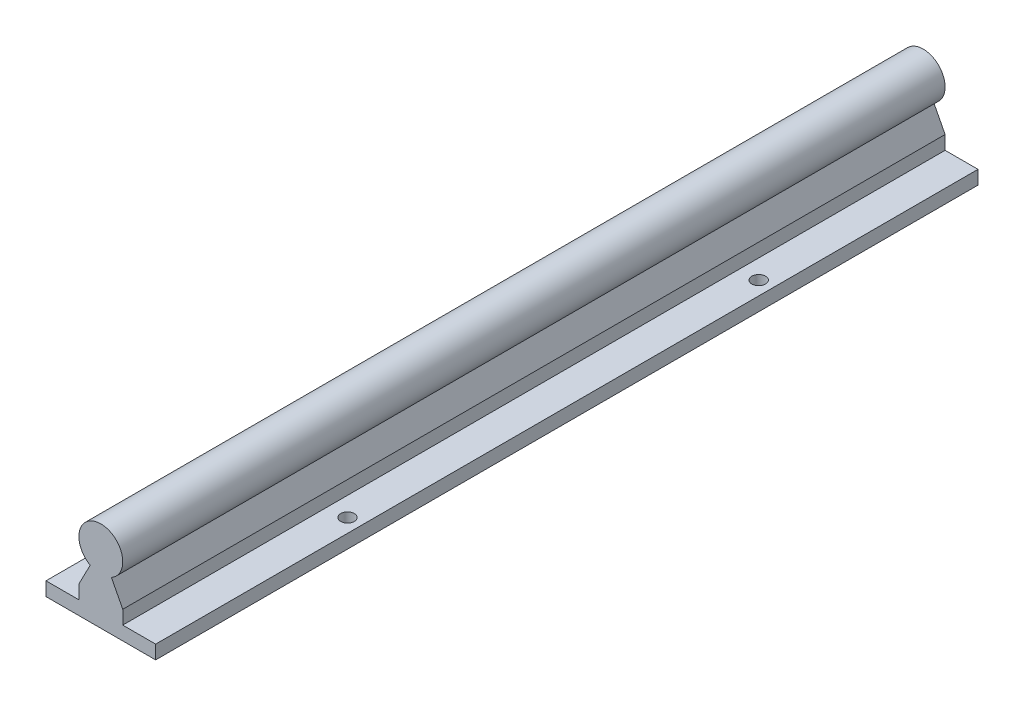
ISO-10303-21;
HEADER;
FILE_DESCRIPTION(('STEP AP214'),'2;1');
FILE_NAME('part.step','',(''),(''),'','','');
FILE_SCHEMA(('AUTOMOTIVE_DESIGN { 1 0 10303 214 1 1 1 1 }'));
ENDSEC;
DATA;
#1=APPLICATION_CONTEXT('core data for automotive mechanical design processes');
#2=APPLICATION_PROTOCOL_DEFINITION('international standard','automotive_design',2000,#1);
#3=PRODUCT_CONTEXT('',#1,'mechanical');
#4=PRODUCT('Part','Part','',(#3));
#5=PRODUCT_RELATED_PRODUCT_CATEGORY('part','',(#4));
#6=PRODUCT_DEFINITION_FORMATION('','',#4);
#7=PRODUCT_DEFINITION_CONTEXT('part definition',#1,'design');
#8=PRODUCT_DEFINITION('design','',#6,#7);
#9=PRODUCT_DEFINITION_SHAPE('','',#8);
#10=(LENGTH_UNIT() NAMED_UNIT(*) SI_UNIT(.MILLI.,.METRE.));
#11=(NAMED_UNIT(*) PLANE_ANGLE_UNIT() SI_UNIT($,.RADIAN.));
#12=(NAMED_UNIT(*) SI_UNIT($,.STERADIAN.) SOLID_ANGLE_UNIT());
#13=UNCERTAINTY_MEASURE_WITH_UNIT(LENGTH_MEASURE(1.E-05),#10,'distance_accuracy_value','');
#14=(GEOMETRIC_REPRESENTATION_CONTEXT(3) GLOBAL_UNCERTAINTY_ASSIGNED_CONTEXT((#13)) GLOBAL_UNIT_ASSIGNED_CONTEXT((#10,
#11,#12)) REPRESENTATION_CONTEXT('',''));
#15=CARTESIAN_POINT('',(0.,0.,0.));
#16=DIRECTION('',(0.,0.,1.));
#17=DIRECTION('',(1.,0.,0.));
#18=AXIS2_PLACEMENT_3D('',#15,#16,#17);
#19=CARTESIAN_POINT('',(-10.3929134539516,5.36146586323541,300.));
#20=DIRECTION('',(-0.88871189671419,0.458466099770382,0.));
#21=DIRECTION('',(-0.458466099770382,-0.888711896714191,0.));
#22=AXIS2_PLACEMENT_3D('',#19,#20,#21);
#23=PLANE('',#22);
#24=DIRECTION('',(0.458466099770382,0.888711896714191,0.));
#25=VECTOR('',#24,1.);
#26=CARTESIAN_POINT('',(-10.3929134539516,5.36146586323541,0.));
#27=LINE('',#26,#25);
#28=CARTESIAN_POINT('',(-8.,10.,0.));
#29=VERTEX_POINT('',#28);
#30=CARTESIAN_POINT('',(-3.87298334620742,18.,0.));
#31=VERTEX_POINT('',#30);
#32=EDGE_CURVE('E144',#29,#31,#27,.T.);
#33=ORIENTED_EDGE('',*,*,#32,.F.);
#34=DIRECTION('',(0.,0.,-1.));
#35=VECTOR('',#34,1.);
#36=CARTESIAN_POINT('',(-8.,10.,300.));
#37=LINE('',#36,#35);
#38=CARTESIAN_POINT('',(-8.,10.,300.));
#39=VERTEX_POINT('',#38);
#40=EDGE_CURVE('E41',#39,#29,#37,.T.);
#41=ORIENTED_EDGE('',*,*,#40,.F.);
#42=DIRECTION('',(0.458466099770382,0.888711896714191,0.));
#43=VECTOR('',#42,1.);
#44=CARTESIAN_POINT('',(-10.3929134539516,5.36146586323541,300.));
#45=LINE('',#44,#43);
#46=CARTESIAN_POINT('',(-3.87298334620742,18.,300.));
#47=VERTEX_POINT('',#46);
#48=EDGE_CURVE('E165',#39,#47,#45,.T.);
#49=ORIENTED_EDGE('',*,*,#48,.T.);
#50=DIRECTION('',(0.,0.,-1.));
#51=VECTOR('',#50,1.);
#52=CARTESIAN_POINT('',(-3.87298334620742,18.,300.));
#53=LINE('',#52,#51);
#54=EDGE_CURVE('E11',#47,#31,#53,.T.);
#55=ORIENTED_EDGE('',*,*,#54,.T.);
#56=EDGE_LOOP('',(#33,#41,#49,#55));
#57=FACE_BOUND('',#56,.T.);
#58=ADVANCED_FACE('F33',(#57),#23,.T.);
#59=CARTESIAN_POINT('',(-8.,0.,300.));
#60=DIRECTION('',(-1.,0.,0.));
#61=DIRECTION('',(0.,0.,1.));
#62=AXIS2_PLACEMENT_3D('',#59,#60,#61);
#63=PLANE('',#62);
#64=DIRECTION('',(0.,1.,0.));
#65=VECTOR('',#64,1.);
#66=CARTESIAN_POINT('',(-8.,0.,0.));
#67=LINE('',#66,#65);
#68=CARTESIAN_POINT('',(-8.,5.,0.));
#69=VERTEX_POINT('',#68);
#70=EDGE_CURVE('E146',#69,#29,#67,.T.);
#71=ORIENTED_EDGE('',*,*,#70,.F.);
#72=DIRECTION('',(0.,0.,-1.));
#73=VECTOR('',#72,1.);
#74=CARTESIAN_POINT('',(-8.,5.,300.));
#75=LINE('',#74,#73);
#76=CARTESIAN_POINT('',(-8.,5.,300.));
#77=VERTEX_POINT('',#76);
#78=EDGE_CURVE('E175',#77,#69,#75,.T.);
#79=ORIENTED_EDGE('',*,*,#78,.F.);
#80=DIRECTION('',(0.,1.,0.));
#81=VECTOR('',#80,1.);
#82=CARTESIAN_POINT('',(-8.,0.,300.));
#83=LINE('',#82,#81);
#84=EDGE_CURVE('E181',#77,#39,#83,.T.);
#85=ORIENTED_EDGE('',*,*,#84,.T.);
#86=ORIENTED_EDGE('',*,*,#40,.T.);
#87=EDGE_LOOP('',(#71,#79,#85,#86));
#88=FACE_BOUND('',#87,.T.);
#89=ADVANCED_FACE('F179',(#88),#63,.T.);
#90=CARTESIAN_POINT('',(0.,5.,300.));
#91=DIRECTION('',(0.,1.,0.));
#92=DIRECTION('',(0.,0.,1.));
#93=AXIS2_PLACEMENT_3D('',#90,#91,#92);
#94=PLANE('',#93);
#95=CARTESIAN_POINT('',(-15.,5.,75.));
#96=DIRECTION('',(0.,1.,0.));
#97=DIRECTION('',(0.,0.,1.));
#98=AXIS2_PLACEMENT_3D('',#95,#96,#97);
#99=CIRCLE('',#98,2.49999999999999);
#100=CARTESIAN_POINT('',(-15.,5.,77.5));
#101=VERTEX_POINT('',#100);
#102=EDGE_CURVE('E238',#101,#101,#99,.T.);
#103=ORIENTED_EDGE('',*,*,#102,.F.);
#104=EDGE_LOOP('',(#103));
#105=FACE_BOUND('',#104,.T.);
#106=CARTESIAN_POINT('',(-15.,5.,225.));
#107=DIRECTION('',(0.,1.,0.));
#108=DIRECTION('',(0.,0.,1.));
#109=AXIS2_PLACEMENT_3D('',#106,#107,#108);
#110=CIRCLE('',#109,2.49999999999999);
#111=CARTESIAN_POINT('',(-15.,5.,227.5));
#112=VERTEX_POINT('',#111);
#113=EDGE_CURVE('E226',#112,#112,#110,.T.);
#114=ORIENTED_EDGE('',*,*,#113,.F.);
#115=EDGE_LOOP('',(#114));
#116=FACE_BOUND('',#115,.T.);
#117=DIRECTION('',(1.,0.,0.));
#118=VECTOR('',#117,1.);
#119=CARTESIAN_POINT('',(0.,5.,0.));
#120=LINE('',#119,#118);
#121=CARTESIAN_POINT('',(-20.,5.,0.));
#122=VERTEX_POINT('',#121);
#123=EDGE_CURVE('E150',#122,#69,#120,.T.);
#124=ORIENTED_EDGE('',*,*,#123,.F.);
#125=DIRECTION('',(0.,0.,-1.));
#126=VECTOR('',#125,1.);
#127=CARTESIAN_POINT('',(-20.,5.,300.));
#128=LINE('',#127,#126);
#129=CARTESIAN_POINT('',(-20.,5.,300.));
#130=VERTEX_POINT('',#129);
#131=EDGE_CURVE('E173',#130,#122,#128,.T.);
#132=ORIENTED_EDGE('',*,*,#131,.F.);
#133=DIRECTION('',(1.,0.,0.));
#134=VECTOR('',#133,1.);
#135=CARTESIAN_POINT('',(0.,5.,300.));
#136=LINE('',#135,#134);
#137=EDGE_CURVE('E191',#130,#77,#136,.T.);
#138=ORIENTED_EDGE('',*,*,#137,.T.);
#139=ORIENTED_EDGE('',*,*,#78,.T.);
#140=EDGE_LOOP('',(#124,#132,#138,#139));
#141=FACE_BOUND('',#140,.T.);
#142=ADVANCED_FACE('F188',(#105,#116,#141),#94,.T.);
#143=CARTESIAN_POINT('',(-20.,0.,300.));
#144=DIRECTION('',(-1.,0.,0.));
#145=DIRECTION('',(0.,0.,1.));
#146=AXIS2_PLACEMENT_3D('',#143,#144,#145);
#147=PLANE('',#146);
#148=DIRECTION('',(0.,1.,0.));
#149=VECTOR('',#148,1.);
#150=CARTESIAN_POINT('',(-20.,0.,0.));
#151=LINE('',#150,#149);
#152=CARTESIAN_POINT('',(-20.,0.,0.));
#153=VERTEX_POINT('',#152);
#154=EDGE_CURVE('E153',#153,#122,#151,.T.);
#155=ORIENTED_EDGE('',*,*,#154,.F.);
#156=DIRECTION('',(0.,0.,-1.));
#157=VECTOR('',#156,1.);
#158=CARTESIAN_POINT('',(-20.,0.,300.));
#159=LINE('',#158,#157);
#160=CARTESIAN_POINT('',(-20.,0.,300.));
#161=VERTEX_POINT('',#160);
#162=EDGE_CURVE('E171',#161,#153,#159,.T.);
#163=ORIENTED_EDGE('',*,*,#162,.F.);
#164=DIRECTION('',(0.,1.,0.));
#165=VECTOR('',#164,1.);
#166=CARTESIAN_POINT('',(-20.,0.,300.));
#167=LINE('',#166,#165);
#168=EDGE_CURVE('E195',#161,#130,#167,.T.);
#169=ORIENTED_EDGE('',*,*,#168,.T.);
#170=ORIENTED_EDGE('',*,*,#131,.T.);
#171=EDGE_LOOP('',(#155,#163,#169,#170));
#172=FACE_BOUND('',#171,.T.);
#173=ADVANCED_FACE('F201',(#172),#147,.T.);
#174=CARTESIAN_POINT('',(0.,0.,300.));
#175=DIRECTION('',(0.,1.,0.));
#176=DIRECTION('',(0.,0.,1.));
#177=AXIS2_PLACEMENT_3D('',#174,#175,#176);
#178=PLANE('',#177);
#179=CARTESIAN_POINT('',(-15.,0.,75.));
#180=DIRECTION('',(0.,1.,0.));
#181=DIRECTION('',(0.,0.,1.));
#182=AXIS2_PLACEMENT_3D('',#179,#180,#181);
#183=CIRCLE('',#182,2.49999999999999);
#184=CARTESIAN_POINT('',(-15.,0.,77.5));
#185=VERTEX_POINT('',#184);
#186=EDGE_CURVE('E235',#185,#185,#183,.T.);
#187=ORIENTED_EDGE('',*,*,#186,.T.);
#188=EDGE_LOOP('',(#187));
#189=FACE_BOUND('',#188,.T.);
#190=CARTESIAN_POINT('',(15.,0.,75.));
#191=DIRECTION('',(0.,1.,0.));
#192=DIRECTION('',(0.,0.,1.));
#193=AXIS2_PLACEMENT_3D('',#190,#191,#192);
#194=CIRCLE('',#193,2.49999999999999);
#195=CARTESIAN_POINT('',(15.,0.,77.5));
#196=VERTEX_POINT('',#195);
#197=EDGE_CURVE('E229',#196,#196,#194,.T.);
#198=ORIENTED_EDGE('',*,*,#197,.T.);
#199=EDGE_LOOP('',(#198));
#200=FACE_BOUND('',#199,.T.);
#201=CARTESIAN_POINT('',(-15.,0.,225.));
#202=DIRECTION('',(0.,1.,0.));
#203=DIRECTION('',(0.,0.,1.));
#204=AXIS2_PLACEMENT_3D('',#201,#202,#203);
#205=CIRCLE('',#204,2.49999999999999);
#206=CARTESIAN_POINT('',(-15.,0.,227.5));
#207=VERTEX_POINT('',#206);
#208=EDGE_CURVE('E223',#207,#207,#205,.T.);
#209=ORIENTED_EDGE('',*,*,#208,.T.);
#210=EDGE_LOOP('',(#209));
#211=FACE_BOUND('',#210,.T.);
#212=CARTESIAN_POINT('',(15.,0.,225.));
#213=DIRECTION('',(0.,1.,0.));
#214=DIRECTION('',(0.,0.,1.));
#215=AXIS2_PLACEMENT_3D('',#212,#213,#214);
#216=CIRCLE('',#215,2.49999999999999);
#217=CARTESIAN_POINT('',(15.,0.,227.5));
#218=VERTEX_POINT('',#217);
#219=EDGE_CURVE('E215',#218,#218,#216,.T.);
#220=ORIENTED_EDGE('',*,*,#219,.T.);
#221=EDGE_LOOP('',(#220));
#222=FACE_BOUND('',#221,.T.);
#223=DIRECTION('',(1.,0.,0.));
#224=VECTOR('',#223,1.);
#225=CARTESIAN_POINT('',(0.,0.,0.));
#226=LINE('',#225,#224);
#227=CARTESIAN_POINT('',(20.,0.,0.));
#228=VERTEX_POINT('',#227);
#229=EDGE_CURVE('E156',#153,#228,#226,.T.);
#230=ORIENTED_EDGE('',*,*,#229,.T.);
#231=DIRECTION('',(0.,0.,-1.));
#232=VECTOR('',#231,1.);
#233=CARTESIAN_POINT('',(20.,0.,300.));
#234=LINE('',#233,#232);
#235=CARTESIAN_POINT('',(20.,0.,300.));
#236=VERTEX_POINT('',#235);
#237=EDGE_CURVE('E133',#236,#228,#234,.T.);
#238=ORIENTED_EDGE('',*,*,#237,.F.);
#239=DIRECTION('',(1.,0.,0.));
#240=VECTOR('',#239,1.);
#241=CARTESIAN_POINT('',(0.,0.,300.));
#242=LINE('',#241,#240);
#243=EDGE_CURVE('E121',#161,#236,#242,.T.);
#244=ORIENTED_EDGE('',*,*,#243,.F.);
#245=ORIENTED_EDGE('',*,*,#162,.T.);
#246=EDGE_LOOP('',(#230,#238,#244,#245));
#247=FACE_BOUND('',#246,.T.);
#248=ADVANCED_FACE('F203',(#189,#200,#211,#222,#247),#178,.F.);
#249=CARTESIAN_POINT('',(20.,0.,300.));
#250=DIRECTION('',(-1.,0.,0.));
#251=DIRECTION('',(0.,0.,1.));
#252=AXIS2_PLACEMENT_3D('',#249,#250,#251);
#253=PLANE('',#252);
#254=DIRECTION('',(0.,1.,0.));
#255=VECTOR('',#254,1.);
#256=CARTESIAN_POINT('',(20.,0.,0.));
#257=LINE('',#256,#255);
#258=CARTESIAN_POINT('',(20.,5.,0.));
#259=VERTEX_POINT('',#258);
#260=EDGE_CURVE('E130',#228,#259,#257,.T.);
#261=ORIENTED_EDGE('',*,*,#260,.T.);
#262=DIRECTION('',(0.,0.,-1.));
#263=VECTOR('',#262,1.);
#264=CARTESIAN_POINT('',(20.,5.,300.));
#265=LINE('',#264,#263);
#266=CARTESIAN_POINT('',(20.,5.,300.));
#267=VERTEX_POINT('',#266);
#268=EDGE_CURVE('E127',#267,#259,#265,.T.);
#269=ORIENTED_EDGE('',*,*,#268,.F.);
#270=DIRECTION('',(0.,1.,0.));
#271=VECTOR('',#270,1.);
#272=CARTESIAN_POINT('',(20.,0.,300.));
#273=LINE('',#272,#271);
#274=EDGE_CURVE('E113',#236,#267,#273,.T.);
#275=ORIENTED_EDGE('',*,*,#274,.F.);
#276=ORIENTED_EDGE('',*,*,#237,.T.);
#277=EDGE_LOOP('',(#261,#269,#275,#276));
#278=FACE_BOUND('',#277,.T.);
#279=ADVANCED_FACE('F128',(#278),#253,.F.);
#280=CARTESIAN_POINT('',(0.,5.,300.));
#281=DIRECTION('',(0.,-1.,0.));
#282=DIRECTION('',(0.,0.,-1.));
#283=AXIS2_PLACEMENT_3D('',#280,#281,#282);
#284=PLANE('',#283);
#285=CARTESIAN_POINT('',(15.,5.,75.));
#286=DIRECTION('',(0.,1.,0.));
#287=DIRECTION('',(0.,0.,1.));
#288=AXIS2_PLACEMENT_3D('',#285,#286,#287);
#289=CIRCLE('',#288,2.49999999999999);
#290=CARTESIAN_POINT('',(15.,5.,77.5));
#291=VERTEX_POINT('',#290);
#292=EDGE_CURVE('E232',#291,#291,#289,.T.);
#293=ORIENTED_EDGE('',*,*,#292,.F.);
#294=EDGE_LOOP('',(#293));
#295=FACE_BOUND('',#294,.T.);
#296=CARTESIAN_POINT('',(15.,5.,225.));
#297=DIRECTION('',(0.,1.,0.));
#298=DIRECTION('',(0.,0.,1.));
#299=AXIS2_PLACEMENT_3D('',#296,#297,#298);
#300=CIRCLE('',#299,2.49999999999999);
#301=CARTESIAN_POINT('',(15.,5.,227.5));
#302=VERTEX_POINT('',#301);
#303=EDGE_CURVE('E218',#302,#302,#300,.T.);
#304=ORIENTED_EDGE('',*,*,#303,.F.);
#305=EDGE_LOOP('',(#304));
#306=FACE_BOUND('',#305,.T.);
#307=DIRECTION('',(-1.,0.,0.));
#308=VECTOR('',#307,1.);
#309=CARTESIAN_POINT('',(0.,5.,0.));
#310=LINE('',#309,#308);
#311=CARTESIAN_POINT('',(8.,5.,0.));
#312=VERTEX_POINT('',#311);
#313=EDGE_CURVE('E159',#259,#312,#310,.T.);
#314=ORIENTED_EDGE('',*,*,#313,.T.);
#315=DIRECTION('',(0.,0.,-1.));
#316=VECTOR('',#315,1.);
#317=CARTESIAN_POINT('',(8.,5.,300.));
#318=LINE('',#317,#316);
#319=CARTESIAN_POINT('',(8.,5.,300.));
#320=VERTEX_POINT('',#319);
#321=EDGE_CURVE('E134',#320,#312,#318,.T.);
#322=ORIENTED_EDGE('',*,*,#321,.F.);
#323=DIRECTION('',(-1.,0.,0.));
#324=VECTOR('',#323,1.);
#325=CARTESIAN_POINT('',(0.,5.,300.));
#326=LINE('',#325,#324);
#327=EDGE_CURVE('E117',#267,#320,#326,.T.);
#328=ORIENTED_EDGE('',*,*,#327,.F.);
#329=ORIENTED_EDGE('',*,*,#268,.T.);
#330=EDGE_LOOP('',(#314,#322,#328,#329));
#331=FACE_BOUND('',#330,.T.);
#332=ADVANCED_FACE('F136',(#295,#306,#331),#284,.F.);
#333=CARTESIAN_POINT('',(8.,0.,300.));
#334=DIRECTION('',(-1.,0.,0.));
#335=DIRECTION('',(0.,0.,1.));
#336=AXIS2_PLACEMENT_3D('',#333,#334,#335);
#337=PLANE('',#336);
#338=DIRECTION('',(0.,1.,0.));
#339=VECTOR('',#338,1.);
#340=CARTESIAN_POINT('',(8.,0.,0.));
#341=LINE('',#340,#339);
#342=CARTESIAN_POINT('',(8.,10.,0.));
#343=VERTEX_POINT('',#342);
#344=EDGE_CURVE('E81',#312,#343,#341,.T.);
#345=ORIENTED_EDGE('',*,*,#344,.T.);
#346=DIRECTION('',(0.,0.,-1.));
#347=VECTOR('',#346,1.);
#348=CARTESIAN_POINT('',(8.,10.,300.));
#349=LINE('',#348,#347);
#350=CARTESIAN_POINT('',(8.,10.,300.));
#351=VERTEX_POINT('',#350);
#352=EDGE_CURVE('E167',#351,#343,#349,.T.);
#353=ORIENTED_EDGE('',*,*,#352,.F.);
#354=DIRECTION('',(0.,1.,0.));
#355=VECTOR('',#354,1.);
#356=CARTESIAN_POINT('',(8.,0.,300.));
#357=LINE('',#356,#355);
#358=EDGE_CURVE('E49',#320,#351,#357,.T.);
#359=ORIENTED_EDGE('',*,*,#358,.F.);
#360=ORIENTED_EDGE('',*,*,#321,.T.);
#361=EDGE_LOOP('',(#345,#353,#359,#360));
#362=FACE_BOUND('',#361,.T.);
#363=ADVANCED_FACE('F204',(#362),#337,.F.);
#364=CARTESIAN_POINT('',(10.3929134539516,5.36146586323541,300.));
#365=DIRECTION('',(-0.88871189671419,-0.458466099770382,0.));
#366=DIRECTION('',(0.458466099770382,-0.888711896714191,0.));
#367=AXIS2_PLACEMENT_3D('',#364,#365,#366);
#368=PLANE('',#367);
#369=DIRECTION('',(-0.458466099770382,0.888711896714191,0.));
#370=VECTOR('',#369,1.);
#371=CARTESIAN_POINT('',(10.3929134539516,5.36146586323541,0.));
#372=LINE('',#371,#370);
#373=CARTESIAN_POINT('',(3.87298334620742,18.,0.));
#374=VERTEX_POINT('',#373);
#375=EDGE_CURVE('E162',#343,#374,#372,.T.);
#376=ORIENTED_EDGE('',*,*,#375,.T.);
#377=DIRECTION('',(0.,0.,-1.));
#378=VECTOR('',#377,1.);
#379=CARTESIAN_POINT('',(3.87298334620742,18.,300.));
#380=LINE('',#379,#378);
#381=CARTESIAN_POINT('',(3.87298334620742,18.,300.));
#382=VERTEX_POINT('',#381);
#383=EDGE_CURVE('E143',#382,#374,#380,.T.);
#384=ORIENTED_EDGE('',*,*,#383,.F.);
#385=DIRECTION('',(-0.458466099770382,0.888711896714191,0.));
#386=VECTOR('',#385,1.);
#387=CARTESIAN_POINT('',(10.3929134539516,5.36146586323541,300.));
#388=LINE('',#387,#386);
#389=EDGE_CURVE('E138',#351,#382,#388,.T.);
#390=ORIENTED_EDGE('',*,*,#389,.F.);
#391=ORIENTED_EDGE('',*,*,#352,.T.);
#392=EDGE_LOOP('',(#376,#384,#390,#391));
#393=FACE_BOUND('',#392,.T.);
#394=ADVANCED_FACE('F208',(#393),#368,.F.);
#395=CARTESIAN_POINT('',(0.,0.,300.));
#396=DIRECTION('',(0.,0.,1.));
#397=DIRECTION('',(1.,0.,0.));
#398=AXIS2_PLACEMENT_3D('',#395,#396,#397);
#399=PLANE('',#398);
#400=ORIENTED_EDGE('',*,*,#389,.T.);
#401=CARTESIAN_POINT('',(0.,25.,300.));
#402=DIRECTION('',(0.,0.,1.));
#403=DIRECTION('',(1.,0.,0.));
#404=AXIS2_PLACEMENT_3D('',#401,#402,#403);
#405=CIRCLE('',#404,8.);
#406=EDGE_CURVE('E147',#382,#47,#405,.T.);
#407=ORIENTED_EDGE('',*,*,#406,.T.);
#408=ORIENTED_EDGE('',*,*,#48,.F.);
#409=ORIENTED_EDGE('',*,*,#84,.F.);
#410=ORIENTED_EDGE('',*,*,#137,.F.);
#411=ORIENTED_EDGE('',*,*,#168,.F.);
#412=ORIENTED_EDGE('',*,*,#243,.T.);
#413=ORIENTED_EDGE('',*,*,#274,.T.);
#414=ORIENTED_EDGE('',*,*,#327,.T.);
#415=ORIENTED_EDGE('',*,*,#358,.T.);
#416=EDGE_LOOP('',(#400,#407,#408,#409,#410,#411,#412,#413,#414,#415));
#417=FACE_BOUND('',#416,.T.);
#418=ADVANCED_FACE('F115',(#417),#399,.T.);
#419=CARTESIAN_POINT('',(0.,0.,0.));
#420=DIRECTION('',(0.,0.,1.));
#421=DIRECTION('',(1.,0.,0.));
#422=AXIS2_PLACEMENT_3D('',#419,#420,#421);
#423=PLANE('',#422);
#424=ORIENTED_EDGE('',*,*,#32,.T.);
#425=CARTESIAN_POINT('',(0.,25.,0.));
#426=DIRECTION('',(0.,0.,1.));
#427=DIRECTION('',(1.,0.,0.));
#428=AXIS2_PLACEMENT_3D('',#425,#426,#427);
#429=CIRCLE('',#428,8.);
#430=EDGE_CURVE('E89',#374,#31,#429,.T.);
#431=ORIENTED_EDGE('',*,*,#430,.F.);
#432=ORIENTED_EDGE('',*,*,#375,.F.);
#433=ORIENTED_EDGE('',*,*,#344,.F.);
#434=ORIENTED_EDGE('',*,*,#313,.F.);
#435=ORIENTED_EDGE('',*,*,#260,.F.);
#436=ORIENTED_EDGE('',*,*,#229,.F.);
#437=ORIENTED_EDGE('',*,*,#154,.T.);
#438=ORIENTED_EDGE('',*,*,#123,.T.);
#439=ORIENTED_EDGE('',*,*,#70,.T.);
#440=EDGE_LOOP('',(#424,#431,#432,#433,#434,#435,#436,#437,#438,#439));
#441=FACE_BOUND('',#440,.T.);
#442=ADVANCED_FACE('F183',(#441),#423,.F.);
#443=CARTESIAN_POINT('',(0.,25.,300.));
#444=DIRECTION('',(0.,0.,-1.));
#445=DIRECTION('',(-1.,0.,0.));
#446=AXIS2_PLACEMENT_3D('',#443,#444,#445);
#447=CYLINDRICAL_SURFACE('',#446,8.);
#448=ORIENTED_EDGE('',*,*,#54,.F.);
#449=ORIENTED_EDGE('',*,*,#406,.F.);
#450=ORIENTED_EDGE('',*,*,#383,.T.);
#451=ORIENTED_EDGE('',*,*,#430,.T.);
#452=EDGE_LOOP('',(#448,#449,#450,#451));
#453=FACE_BOUND('',#452,.T.);
#454=ADVANCED_FACE('F214',(#453),#447,.T.);
#455=CARTESIAN_POINT('',(15.,5.,225.));
#456=DIRECTION('',(0.,1.,0.));
#457=DIRECTION('',(0.,0.,1.));
#458=AXIS2_PLACEMENT_3D('',#455,#456,#457);
#459=CYLINDRICAL_SURFACE('',#458,2.49999999999999);
#460=ORIENTED_EDGE('',*,*,#219,.F.);
#461=EDGE_LOOP('',(#460));
#462=FACE_BOUND('',#461,.T.);
#463=ORIENTED_EDGE('',*,*,#303,.T.);
#464=EDGE_LOOP('',(#463));
#465=FACE_BOUND('',#464,.T.);
#466=ADVANCED_FACE('F252',(#462,#465),#459,.F.);
#467=CARTESIAN_POINT('',(-15.,5.,225.));
#468=DIRECTION('',(0.,1.,0.));
#469=DIRECTION('',(0.,0.,1.));
#470=AXIS2_PLACEMENT_3D('',#467,#468,#469);
#471=CYLINDRICAL_SURFACE('',#470,2.49999999999999);
#472=ORIENTED_EDGE('',*,*,#208,.F.);
#473=EDGE_LOOP('',(#472));
#474=FACE_BOUND('',#473,.T.);
#475=ORIENTED_EDGE('',*,*,#113,.T.);
#476=EDGE_LOOP('',(#475));
#477=FACE_BOUND('',#476,.T.);
#478=ADVANCED_FACE('F249',(#474,#477),#471,.F.);
#479=CARTESIAN_POINT('',(15.,5.,75.));
#480=DIRECTION('',(0.,1.,0.));
#481=DIRECTION('',(0.,0.,1.));
#482=AXIS2_PLACEMENT_3D('',#479,#480,#481);
#483=CYLINDRICAL_SURFACE('',#482,2.49999999999999);
#484=ORIENTED_EDGE('',*,*,#197,.F.);
#485=EDGE_LOOP('',(#484));
#486=FACE_BOUND('',#485,.T.);
#487=ORIENTED_EDGE('',*,*,#292,.T.);
#488=EDGE_LOOP('',(#487));
#489=FACE_BOUND('',#488,.T.);
#490=ADVANCED_FACE('F251',(#486,#489),#483,.F.);
#491=CARTESIAN_POINT('',(-15.,5.,75.));
#492=DIRECTION('',(0.,1.,0.));
#493=DIRECTION('',(0.,0.,1.));
#494=AXIS2_PLACEMENT_3D('',#491,#492,#493);
#495=CYLINDRICAL_SURFACE('',#494,2.49999999999999);
#496=ORIENTED_EDGE('',*,*,#186,.F.);
#497=EDGE_LOOP('',(#496));
#498=FACE_BOUND('',#497,.T.);
#499=ORIENTED_EDGE('',*,*,#102,.T.);
#500=EDGE_LOOP('',(#499));
#501=FACE_BOUND('',#500,.T.);
#502=ADVANCED_FACE('F242',(#498,#501),#495,.F.);
#503=CLOSED_SHELL('',(#58,#89,#142,#173,#248,#279,#332,#363,#394,#418,#442,#454,#466,#478,#490,#502));
#504=MANIFOLD_SOLID_BREP('B2',#503);
#505=ADVANCED_BREP_SHAPE_REPRESENTATION('',(#18,#504),#14);
#506=SHAPE_DEFINITION_REPRESENTATION(#9,#505);
ENDSEC;
END-ISO-10303-21;
